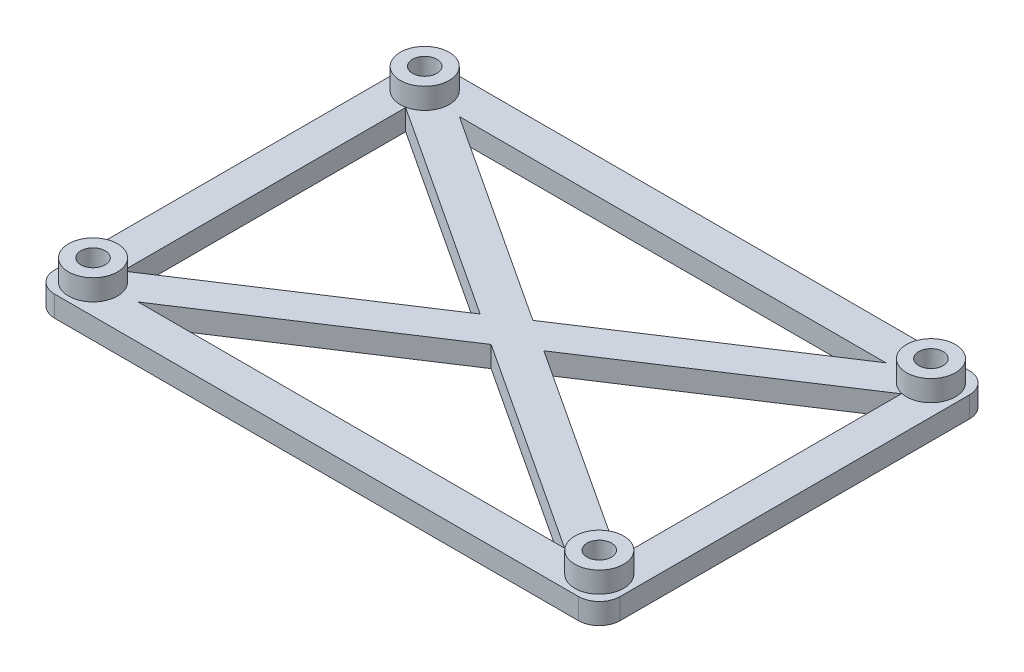
ISO-10303-21;
HEADER;
FILE_DESCRIPTION(('STEP AP214'),'2;1');
FILE_NAME('part.step','',(''),(''),'','','');
FILE_SCHEMA(('AUTOMOTIVE_DESIGN { 1 0 10303 214 1 1 1 1 }'));
ENDSEC;
DATA;
#1=APPLICATION_CONTEXT('core data for automotive mechanical design processes');
#2=APPLICATION_PROTOCOL_DEFINITION('international standard','automotive_design',2000,#1);
#3=PRODUCT_CONTEXT('',#1,'mechanical');
#4=PRODUCT('Part','Part','',(#3));
#5=PRODUCT_RELATED_PRODUCT_CATEGORY('part','',(#4));
#6=PRODUCT_DEFINITION_FORMATION('','',#4);
#7=PRODUCT_DEFINITION_CONTEXT('part definition',#1,'design');
#8=PRODUCT_DEFINITION('design','',#6,#7);
#9=PRODUCT_DEFINITION_SHAPE('','',#8);
#10=(LENGTH_UNIT() NAMED_UNIT(*) SI_UNIT(.MILLI.,.METRE.));
#11=(NAMED_UNIT(*) PLANE_ANGLE_UNIT() SI_UNIT($,.RADIAN.));
#12=(NAMED_UNIT(*) SI_UNIT($,.STERADIAN.) SOLID_ANGLE_UNIT());
#13=UNCERTAINTY_MEASURE_WITH_UNIT(LENGTH_MEASURE(1.E-05),#10,'distance_accuracy_value','');
#14=(GEOMETRIC_REPRESENTATION_CONTEXT(3) GLOBAL_UNCERTAINTY_ASSIGNED_CONTEXT((#13)) GLOBAL_UNIT_ASSIGNED_CONTEXT((#10,
#11,#12)) REPRESENTATION_CONTEXT('',''));
#15=CARTESIAN_POINT('',(0.,0.,0.));
#16=DIRECTION('',(0.,0.,1.));
#17=DIRECTION('',(1.,0.,0.));
#18=AXIS2_PLACEMENT_3D('',#15,#16,#17);
#19=CARTESIAN_POINT('',(0.,3.,0.));
#20=DIRECTION('',(0.,1.,0.));
#21=DIRECTION('',(0.,0.,1.));
#22=AXIS2_PLACEMENT_3D('',#19,#20,#21);
#23=PLANE('',#22);
#24=DIRECTION('',(0.,0.,-1.));
#25=VECTOR('',#24,1.);
#26=CARTESIAN_POINT('',(35.5,3.,0.));
#27=LINE('',#26,#25);
#28=CARTESIAN_POINT('',(35.5,3.,20.2698386511448));
#29=VERTEX_POINT('',#28);
#30=CARTESIAN_POINT('',(35.5,3.,-20.2698386511449));
#31=VERTEX_POINT('',#30);
#32=EDGE_CURVE('E307',#29,#31,#27,.T.);
#33=ORIENTED_EDGE('',*,*,#32,.F.);
#34=DIRECTION('',(0.836461129579753,0.,0.548026257310873));
#35=VECTOR('',#34,1.);
#36=CARTESIAN_POINT('',(1.37006564327722,3.,-2.09115282394944));
#37=LINE('',#36,#35);
#38=CARTESIAN_POINT('',(4.56182521667361,3.,0.));
#39=VERTEX_POINT('',#38);
#40=EDGE_CURVE('E302',#39,#29,#37,.T.);
#41=ORIENTED_EDGE('',*,*,#40,.F.);
#42=DIRECTION('',(-0.836461129579753,0.,0.548026257310873));
#43=VECTOR('',#42,1.);
#44=CARTESIAN_POINT('',(1.37006564327715,3.,2.09115282394934));
#45=LINE('',#44,#43);
#46=EDGE_CURVE('E301',#31,#39,#45,.T.);
#47=ORIENTED_EDGE('',*,*,#46,.F.);
#48=EDGE_LOOP('',(#33,#41,#47));
#49=FACE_BOUND('',#48,.T.);
#50=DIRECTION('',(-0.836461129579754,0.,-0.548026257310873));
#51=VECTOR('',#50,1.);
#52=CARTESIAN_POINT('',(-1.37006564327714,3.,2.09115282394933));
#53=LINE('',#52,#51);
#54=CARTESIAN_POINT('',(-4.5618252166736,3.,0.));
#55=VERTEX_POINT('',#54);
#56=CARTESIAN_POINT('',(-35.5,3.,-20.2698386511449));
#57=VERTEX_POINT('',#56);
#58=EDGE_CURVE('E299',#55,#57,#53,.T.);
#59=ORIENTED_EDGE('',*,*,#58,.F.);
#60=DIRECTION('',(0.836461129579753,0.,-0.548026257310873));
#61=VECTOR('',#60,1.);
#62=CARTESIAN_POINT('',(-1.37006564327721,3.,-2.09115282394943));
#63=LINE('',#62,#61);
#64=CARTESIAN_POINT('',(-35.5,3.,20.2698386511448));
#65=VERTEX_POINT('',#64);
#66=EDGE_CURVE('E295',#65,#55,#63,.T.);
#67=ORIENTED_EDGE('',*,*,#66,.F.);
#68=DIRECTION('',(0.,0.,1.));
#69=VECTOR('',#68,1.);
#70=CARTESIAN_POINT('',(-35.5,3.,0.));
#71=LINE('',#70,#69);
#72=EDGE_CURVE('E293',#57,#65,#71,.T.);
#73=ORIENTED_EDGE('',*,*,#72,.F.);
#74=EDGE_LOOP('',(#59,#67,#73));
#75=FACE_BOUND('',#74,.T.);
#76=DIRECTION('',(0.836461129579753,0.,0.548026257310873));
#77=VECTOR('',#76,1.);
#78=CARTESIAN_POINT('',(1.37006564327721,3.,-2.09115282394943));
#79=LINE('',#78,#77);
#80=CARTESIAN_POINT('',(-30.543437941221,3.,-23.));
#81=VERTEX_POINT('',#80);
#82=CARTESIAN_POINT('',(0.,3.,-2.98878203851036));
#83=VERTEX_POINT('',#82);
#84=EDGE_CURVE('E192',#81,#83,#79,.T.);
#85=ORIENTED_EDGE('',*,*,#84,.F.);
#86=DIRECTION('',(-1.,0.,0.));
#87=VECTOR('',#86,1.);
#88=CARTESIAN_POINT('',(0.,3.,-23.));
#89=LINE('',#88,#87);
#90=CARTESIAN_POINT('',(30.543437941221,3.,-23.));
#91=VERTEX_POINT('',#90);
#92=EDGE_CURVE('E283',#91,#81,#89,.T.);
#93=ORIENTED_EDGE('',*,*,#92,.F.);
#94=DIRECTION('',(0.836461129579753,0.,-0.548026257310873));
#95=VECTOR('',#94,1.);
#96=CARTESIAN_POINT('',(-1.37006564327722,3.,-2.09115282394944));
#97=LINE('',#96,#95);
#98=EDGE_CURVE('E290',#83,#91,#97,.T.);
#99=ORIENTED_EDGE('',*,*,#98,.F.);
#100=EDGE_LOOP('',(#85,#93,#99));
#101=FACE_BOUND('',#100,.T.);
#102=DIRECTION('',(1.,0.,0.));
#103=VECTOR('',#102,1.);
#104=CARTESIAN_POINT('',(0.,3.,23.));
#105=LINE('',#104,#103);
#106=CARTESIAN_POINT('',(-30.5434379412212,3.,23.));
#107=VERTEX_POINT('',#106);
#108=CARTESIAN_POINT('',(30.5434379412212,3.,23.));
#109=VERTEX_POINT('',#108);
#110=EDGE_CURVE('E281',#107,#109,#105,.T.);
#111=ORIENTED_EDGE('',*,*,#110,.F.);
#112=DIRECTION('',(-0.836461129579753,0.,0.548026257310873));
#113=VECTOR('',#112,1.);
#114=CARTESIAN_POINT('',(1.37006564327716,3.,2.09115282394936));
#115=LINE('',#114,#113);
#116=CARTESIAN_POINT('',(0.,3.,2.98878203851025));
#117=VERTEX_POINT('',#116);
#118=EDGE_CURVE('E268',#117,#107,#115,.T.);
#119=ORIENTED_EDGE('',*,*,#118,.F.);
#120=DIRECTION('',(-0.836461129579753,0.,-0.548026257310873));
#121=VECTOR('',#120,1.);
#122=CARTESIAN_POINT('',(-1.37006564327715,3.,2.09115282394934));
#123=LINE('',#122,#121);
#124=EDGE_CURVE('E280',#109,#117,#123,.T.);
#125=ORIENTED_EDGE('',*,*,#124,.F.);
#126=EDGE_LOOP('',(#111,#119,#125));
#127=FACE_BOUND('',#126,.T.);
#128=CARTESIAN_POINT('',(36.25,3.,-23.75));
#129=DIRECTION('',(0.,1.,0.));
#130=DIRECTION('',(0.,0.,1.));
#131=AXIS2_PLACEMENT_3D('',#128,#129,#130);
#132=CIRCLE('',#131,3.5);
#133=CARTESIAN_POINT('',(36.25,3.,-20.25));
#134=VERTEX_POINT('',#133);
#135=EDGE_CURVE('E405',#134,#134,#132,.T.);
#136=ORIENTED_EDGE('',*,*,#135,.F.);
#137=EDGE_LOOP('',(#136));
#138=FACE_BOUND('',#137,.T.);
#139=DIRECTION('',(0.,0.,-1.));
#140=VECTOR('',#139,1.);
#141=CARTESIAN_POINT('',(40.5,3.,28.));
#142=LINE('',#141,#140);
#143=CARTESIAN_POINT('',(40.5,3.,25.));
#144=VERTEX_POINT('',#143);
#145=CARTESIAN_POINT('',(40.5,3.,-25.));
#146=VERTEX_POINT('',#145);
#147=EDGE_CURVE('E378',#144,#146,#142,.T.);
#148=ORIENTED_EDGE('',*,*,#147,.T.);
#149=CARTESIAN_POINT('',(37.5,3.,-25.));
#150=DIRECTION('',(0.,1.,0.));
#151=DIRECTION('',(0.,0.,1.));
#152=AXIS2_PLACEMENT_3D('',#149,#150,#151);
#153=CIRCLE('',#152,3.);
#154=CARTESIAN_POINT('',(37.5,3.,-28.));
#155=VERTEX_POINT('',#154);
#156=EDGE_CURVE('E442',#146,#155,#153,.T.);
#157=ORIENTED_EDGE('',*,*,#156,.T.);
#158=DIRECTION('',(-1.,0.,0.));
#159=VECTOR('',#158,1.);
#160=CARTESIAN_POINT('',(40.5,3.,-28.));
#161=LINE('',#160,#159);
#162=CARTESIAN_POINT('',(-37.5,3.,-28.));
#163=VERTEX_POINT('',#162);
#164=EDGE_CURVE('E352',#155,#163,#161,.T.);
#165=ORIENTED_EDGE('',*,*,#164,.T.);
#166=CARTESIAN_POINT('',(-37.5,3.,-25.));
#167=DIRECTION('',(0.,1.,0.));
#168=DIRECTION('',(0.,0.,1.));
#169=AXIS2_PLACEMENT_3D('',#166,#167,#168);
#170=CIRCLE('',#169,3.);
#171=CARTESIAN_POINT('',(-40.5,3.,-25.));
#172=VERTEX_POINT('',#171);
#173=EDGE_CURVE('E435',#163,#172,#170,.T.);
#174=ORIENTED_EDGE('',*,*,#173,.T.);
#175=DIRECTION('',(0.,0.,1.));
#176=VECTOR('',#175,1.);
#177=CARTESIAN_POINT('',(-40.5,3.,28.));
#178=LINE('',#177,#176);
#179=CARTESIAN_POINT('',(-40.5,3.,25.));
#180=VERTEX_POINT('',#179);
#181=EDGE_CURVE('E369',#172,#180,#178,.T.);
#182=ORIENTED_EDGE('',*,*,#181,.T.);
#183=CARTESIAN_POINT('',(-37.5,3.,25.));
#184=DIRECTION('',(0.,1.,0.));
#185=DIRECTION('',(0.,0.,1.));
#186=AXIS2_PLACEMENT_3D('',#183,#184,#185);
#187=CIRCLE('',#186,3.);
#188=CARTESIAN_POINT('',(-37.5,3.,28.));
#189=VERTEX_POINT('',#188);
#190=EDGE_CURVE('E434',#180,#189,#187,.T.);
#191=ORIENTED_EDGE('',*,*,#190,.T.);
#192=DIRECTION('',(1.,0.,0.));
#193=VECTOR('',#192,1.);
#194=CARTESIAN_POINT('',(40.5,3.,28.));
#195=LINE('',#194,#193);
#196=CARTESIAN_POINT('',(37.5,3.,28.));
#197=VERTEX_POINT('',#196);
#198=EDGE_CURVE('E373',#189,#197,#195,.T.);
#199=ORIENTED_EDGE('',*,*,#198,.T.);
#200=CARTESIAN_POINT('',(37.5,3.,25.));
#201=DIRECTION('',(0.,1.,0.));
#202=DIRECTION('',(0.,0.,1.));
#203=AXIS2_PLACEMENT_3D('',#200,#201,#202);
#204=CIRCLE('',#203,3.);
#205=EDGE_CURVE('E437',#197,#144,#204,.T.);
#206=ORIENTED_EDGE('',*,*,#205,.T.);
#207=EDGE_LOOP('',(#148,#157,#165,#174,#182,#191,#199,#206));
#208=FACE_BOUND('',#207,.T.);
#209=CARTESIAN_POINT('',(-36.25,3.,-23.75));
#210=DIRECTION('',(0.,1.,0.));
#211=DIRECTION('',(0.,0.,1.));
#212=AXIS2_PLACEMENT_3D('',#209,#210,#211);
#213=CIRCLE('',#212,3.5);
#214=CARTESIAN_POINT('',(-36.25,3.,-20.25));
#215=VERTEX_POINT('',#214);
#216=EDGE_CURVE('E350',#215,#215,#213,.T.);
#217=ORIENTED_EDGE('',*,*,#216,.F.);
#218=EDGE_LOOP('',(#217));
#219=FACE_BOUND('',#218,.T.);
#220=CARTESIAN_POINT('',(-36.25,3.,23.75));
#221=DIRECTION('',(0.,1.,0.));
#222=DIRECTION('',(0.,0.,1.));
#223=AXIS2_PLACEMENT_3D('',#220,#221,#222);
#224=CIRCLE('',#223,3.5);
#225=CARTESIAN_POINT('',(-36.25,3.,27.25));
#226=VERTEX_POINT('',#225);
#227=EDGE_CURVE('E351',#226,#226,#224,.T.);
#228=ORIENTED_EDGE('',*,*,#227,.F.);
#229=EDGE_LOOP('',(#228));
#230=FACE_BOUND('',#229,.T.);
#231=CARTESIAN_POINT('',(36.25,3.,23.75));
#232=DIRECTION('',(0.,1.,0.));
#233=DIRECTION('',(0.,0.,-1.));
#234=AXIS2_PLACEMENT_3D('',#231,#232,#233);
#235=CIRCLE('',#234,3.5);
#236=CARTESIAN_POINT('',(36.25,3.,20.25));
#237=VERTEX_POINT('',#236);
#238=EDGE_CURVE('E325',#237,#237,#235,.T.);
#239=ORIENTED_EDGE('',*,*,#238,.F.);
#240=EDGE_LOOP('',(#239));
#241=FACE_BOUND('',#240,.T.);
#242=ADVANCED_FACE('F50',(#49,#75,#101,#127,#138,#208,#219,#230,#241),#23,.T.);
#243=CARTESIAN_POINT('',(-40.5,3.,28.));
#244=DIRECTION('',(1.,0.,0.));
#245=DIRECTION('',(0.,0.,-1.));
#246=AXIS2_PLACEMENT_3D('',#243,#244,#245);
#247=PLANE('',#246);
#248=DIRECTION('',(0.,0.,1.));
#249=VECTOR('',#248,1.);
#250=CARTESIAN_POINT('',(-40.5,0.,28.));
#251=LINE('',#250,#249);
#252=CARTESIAN_POINT('',(-40.5,0.,-25.));
#253=VERTEX_POINT('',#252);
#254=CARTESIAN_POINT('',(-40.5,0.,25.));
#255=VERTEX_POINT('',#254);
#256=EDGE_CURVE('E366',#253,#255,#251,.T.);
#257=ORIENTED_EDGE('',*,*,#256,.T.);
#258=DIRECTION('',(0.,-1.,0.));
#259=VECTOR('',#258,1.);
#260=CARTESIAN_POINT('',(-40.5,3.,25.));
#261=LINE('',#260,#259);
#262=EDGE_CURVE('E11',#255,#180,#261,.F.);
#263=ORIENTED_EDGE('',*,*,#262,.T.);
#264=ORIENTED_EDGE('',*,*,#181,.F.);
#265=DIRECTION('',(0.,-1.,0.));
#266=VECTOR('',#265,1.);
#267=CARTESIAN_POINT('',(-40.5,3.,-25.));
#268=LINE('',#267,#266);
#269=EDGE_CURVE('E57',#172,#253,#268,.T.);
#270=ORIENTED_EDGE('',*,*,#269,.T.);
#271=EDGE_LOOP('',(#257,#263,#264,#270));
#272=FACE_BOUND('',#271,.T.);
#273=ADVANCED_FACE('F457',(#272),#247,.F.);
#274=CARTESIAN_POINT('',(40.5,3.,28.));
#275=DIRECTION('',(0.,0.,-1.));
#276=DIRECTION('',(-1.,0.,0.));
#277=AXIS2_PLACEMENT_3D('',#274,#275,#276);
#278=PLANE('',#277);
#279=DIRECTION('',(1.,0.,0.));
#280=VECTOR('',#279,1.);
#281=CARTESIAN_POINT('',(40.5,0.,28.));
#282=LINE('',#281,#280);
#283=CARTESIAN_POINT('',(-37.5,0.,28.));
#284=VERTEX_POINT('',#283);
#285=CARTESIAN_POINT('',(37.5,0.,28.));
#286=VERTEX_POINT('',#285);
#287=EDGE_CURVE('E389',#284,#286,#282,.T.);
#288=ORIENTED_EDGE('',*,*,#287,.T.);
#289=DIRECTION('',(0.,-1.,0.));
#290=VECTOR('',#289,1.);
#291=CARTESIAN_POINT('',(37.5,3.,28.));
#292=LINE('',#291,#290);
#293=EDGE_CURVE('E449',#286,#197,#292,.F.);
#294=ORIENTED_EDGE('',*,*,#293,.T.);
#295=ORIENTED_EDGE('',*,*,#198,.F.);
#296=DIRECTION('',(0.,-1.,0.));
#297=VECTOR('',#296,1.);
#298=CARTESIAN_POINT('',(-37.5,3.,28.));
#299=LINE('',#298,#297);
#300=EDGE_CURVE('E441',#189,#284,#299,.T.);
#301=ORIENTED_EDGE('',*,*,#300,.T.);
#302=EDGE_LOOP('',(#288,#294,#295,#301));
#303=FACE_BOUND('',#302,.T.);
#304=ADVANCED_FACE('F466',(#303),#278,.F.);
#305=CARTESIAN_POINT('',(40.5,3.,28.));
#306=DIRECTION('',(-1.,0.,0.));
#307=DIRECTION('',(0.,0.,1.));
#308=AXIS2_PLACEMENT_3D('',#305,#306,#307);
#309=PLANE('',#308);
#310=DIRECTION('',(0.,0.,-1.));
#311=VECTOR('',#310,1.);
#312=CARTESIAN_POINT('',(40.5,0.,28.));
#313=LINE('',#312,#311);
#314=CARTESIAN_POINT('',(40.5,0.,25.));
#315=VERTEX_POINT('',#314);
#316=CARTESIAN_POINT('',(40.5,0.,-25.));
#317=VERTEX_POINT('',#316);
#318=EDGE_CURVE('E392',#315,#317,#313,.T.);
#319=ORIENTED_EDGE('',*,*,#318,.T.);
#320=DIRECTION('',(0.,-1.,0.));
#321=VECTOR('',#320,1.);
#322=CARTESIAN_POINT('',(40.5,3.,-25.));
#323=LINE('',#322,#321);
#324=EDGE_CURVE('E427',#317,#146,#323,.F.);
#325=ORIENTED_EDGE('',*,*,#324,.T.);
#326=ORIENTED_EDGE('',*,*,#147,.F.);
#327=DIRECTION('',(0.,-1.,0.));
#328=VECTOR('',#327,1.);
#329=CARTESIAN_POINT('',(40.5,3.,25.));
#330=LINE('',#329,#328);
#331=EDGE_CURVE('E422',#144,#315,#330,.T.);
#332=ORIENTED_EDGE('',*,*,#331,.T.);
#333=EDGE_LOOP('',(#319,#325,#326,#332));
#334=FACE_BOUND('',#333,.T.);
#335=ADVANCED_FACE('F477',(#334),#309,.F.);
#336=CARTESIAN_POINT('',(40.5,3.,-28.));
#337=DIRECTION('',(0.,0.,1.));
#338=DIRECTION('',(1.,0.,0.));
#339=AXIS2_PLACEMENT_3D('',#336,#337,#338);
#340=PLANE('',#339);
#341=ORIENTED_EDGE('',*,*,#164,.F.);
#342=DIRECTION('',(0.,-1.,0.));
#343=VECTOR('',#342,1.);
#344=CARTESIAN_POINT('',(37.5,3.,-28.));
#345=LINE('',#344,#343);
#346=CARTESIAN_POINT('',(37.5,0.,-28.));
#347=VERTEX_POINT('',#346);
#348=EDGE_CURVE('E408',#155,#347,#345,.T.);
#349=ORIENTED_EDGE('',*,*,#348,.T.);
#350=DIRECTION('',(-1.,0.,0.));
#351=VECTOR('',#350,1.);
#352=CARTESIAN_POINT('',(40.5,0.,-28.));
#353=LINE('',#352,#351);
#354=CARTESIAN_POINT('',(-37.5,0.,-28.));
#355=VERTEX_POINT('',#354);
#356=EDGE_CURVE('E372',#347,#355,#353,.T.);
#357=ORIENTED_EDGE('',*,*,#356,.T.);
#358=DIRECTION('',(0.,-1.,0.));
#359=VECTOR('',#358,1.);
#360=CARTESIAN_POINT('',(-37.5,3.,-28.));
#361=LINE('',#360,#359);
#362=EDGE_CURVE('E406',#355,#163,#361,.F.);
#363=ORIENTED_EDGE('',*,*,#362,.T.);
#364=EDGE_LOOP('',(#341,#349,#357,#363));
#365=FACE_BOUND('',#364,.T.);
#366=ADVANCED_FACE('F488',(#365),#340,.F.);
#367=CARTESIAN_POINT('',(0.,0.,0.));
#368=DIRECTION('',(0.,1.,0.));
#369=DIRECTION('',(0.,0.,1.));
#370=AXIS2_PLACEMENT_3D('',#367,#368,#369);
#371=PLANE('',#370);
#372=DIRECTION('',(-0.836461129579753,0.,-0.548026257310873));
#373=VECTOR('',#372,1.);
#374=CARTESIAN_POINT('',(35.5,0.,20.2698386511448));
#375=LINE('',#374,#373);
#376=CARTESIAN_POINT('',(35.5,0.,20.2698386511448));
#377=VERTEX_POINT('',#376);
#378=CARTESIAN_POINT('',(4.56182521667361,0.,0.));
#379=VERTEX_POINT('',#378);
#380=EDGE_CURVE('E235',#377,#379,#375,.T.);
#381=ORIENTED_EDGE('',*,*,#380,.F.);
#382=DIRECTION('',(0.,0.,1.));
#383=VECTOR('',#382,1.);
#384=CARTESIAN_POINT('',(35.5,0.,20.2698386511448));
#385=LINE('',#384,#383);
#386=CARTESIAN_POINT('',(35.5,0.,-20.2698386511449));
#387=VERTEX_POINT('',#386);
#388=EDGE_CURVE('E233',#387,#377,#385,.T.);
#389=ORIENTED_EDGE('',*,*,#388,.F.);
#390=DIRECTION('',(0.836461129579753,0.,-0.548026257310873));
#391=VECTOR('',#390,1.);
#392=CARTESIAN_POINT('',(4.56182521667361,0.,0.));
#393=LINE('',#392,#391);
#394=EDGE_CURVE('E225',#379,#387,#393,.T.);
#395=ORIENTED_EDGE('',*,*,#394,.F.);
#396=EDGE_LOOP('',(#381,#389,#395));
#397=FACE_BOUND('',#396,.T.);
#398=DIRECTION('',(-0.836461129579753,0.,0.548026257310873));
#399=VECTOR('',#398,1.);
#400=CARTESIAN_POINT('',(-35.5,0.,20.2698386511448));
#401=LINE('',#400,#399);
#402=CARTESIAN_POINT('',(-4.5618252166736,0.,0.));
#403=VERTEX_POINT('',#402);
#404=CARTESIAN_POINT('',(-35.5,0.,20.2698386511448));
#405=VERTEX_POINT('',#404);
#406=EDGE_CURVE('E246',#403,#405,#401,.T.);
#407=ORIENTED_EDGE('',*,*,#406,.F.);
#408=DIRECTION('',(0.836461129579754,0.,0.548026257310873));
#409=VECTOR('',#408,1.);
#410=CARTESIAN_POINT('',(-4.5618252166736,0.,0.));
#411=LINE('',#410,#409);
#412=CARTESIAN_POINT('',(-35.5,0.,-20.2698386511449));
#413=VERTEX_POINT('',#412);
#414=EDGE_CURVE('E229',#413,#403,#411,.T.);
#415=ORIENTED_EDGE('',*,*,#414,.F.);
#416=DIRECTION('',(0.,0.,-1.));
#417=VECTOR('',#416,1.);
#418=CARTESIAN_POINT('',(-35.5,0.,-20.2698386511449));
#419=LINE('',#418,#417);
#420=EDGE_CURVE('E244',#405,#413,#419,.T.);
#421=ORIENTED_EDGE('',*,*,#420,.F.);
#422=EDGE_LOOP('',(#407,#415,#421));
#423=FACE_BOUND('',#422,.T.);
#424=DIRECTION('',(1.,0.,0.));
#425=VECTOR('',#424,1.);
#426=CARTESIAN_POINT('',(30.543437941221,0.,-23.));
#427=LINE('',#426,#425);
#428=CARTESIAN_POINT('',(-30.543437941221,0.,-23.));
#429=VERTEX_POINT('',#428);
#430=CARTESIAN_POINT('',(30.543437941221,0.,-23.));
#431=VERTEX_POINT('',#430);
#432=EDGE_CURVE('E202',#429,#431,#427,.T.);
#433=ORIENTED_EDGE('',*,*,#432,.F.);
#434=DIRECTION('',(-0.836461129579753,0.,-0.548026257310873));
#435=VECTOR('',#434,1.);
#436=CARTESIAN_POINT('',(0.,0.,-2.98878203851036));
#437=LINE('',#436,#435);
#438=CARTESIAN_POINT('',(0.,0.,-2.98878203851036));
#439=VERTEX_POINT('',#438);
#440=EDGE_CURVE('E189',#439,#429,#437,.T.);
#441=ORIENTED_EDGE('',*,*,#440,.F.);
#442=DIRECTION('',(-0.836461129579753,0.,0.548026257310873));
#443=VECTOR('',#442,1.);
#444=CARTESIAN_POINT('',(0.,0.,-2.98878203851036));
#445=LINE('',#444,#443);
#446=EDGE_CURVE('E200',#431,#439,#445,.T.);
#447=ORIENTED_EDGE('',*,*,#446,.F.);
#448=EDGE_LOOP('',(#433,#441,#447));
#449=FACE_BOUND('',#448,.T.);
#450=DIRECTION('',(0.836461129579753,0.,-0.548026257310873));
#451=VECTOR('',#450,1.);
#452=CARTESIAN_POINT('',(-30.5434379412212,0.,23.));
#453=LINE('',#452,#451);
#454=CARTESIAN_POINT('',(-30.5434379412212,0.,23.));
#455=VERTEX_POINT('',#454);
#456=CARTESIAN_POINT('',(0.,0.,2.98878203851024));
#457=VERTEX_POINT('',#456);
#458=EDGE_CURVE('E258',#455,#457,#453,.T.);
#459=ORIENTED_EDGE('',*,*,#458,.F.);
#460=DIRECTION('',(-1.,0.,0.));
#461=VECTOR('',#460,1.);
#462=CARTESIAN_POINT('',(-30.5434379412212,0.,23.));
#463=LINE('',#462,#461);
#464=CARTESIAN_POINT('',(30.5434379412212,0.,23.));
#465=VERTEX_POINT('',#464);
#466=EDGE_CURVE('E236',#465,#455,#463,.T.);
#467=ORIENTED_EDGE('',*,*,#466,.F.);
#468=DIRECTION('',(0.836461129579753,0.,0.548026257310873));
#469=VECTOR('',#468,1.);
#470=CARTESIAN_POINT('',(30.5434379412212,0.,23.));
#471=LINE('',#470,#469);
#472=EDGE_CURVE('E257',#457,#465,#471,.T.);
#473=ORIENTED_EDGE('',*,*,#472,.F.);
#474=EDGE_LOOP('',(#459,#467,#473));
#475=FACE_BOUND('',#474,.T.);
#476=CARTESIAN_POINT('',(36.25,0.,23.7499999999999));
#477=DIRECTION('',(0.,-1.,0.));
#478=DIRECTION('',(0.,0.,-1.));
#479=AXIS2_PLACEMENT_3D('',#476,#477,#478);
#480=CIRCLE('',#479,1.75);
#481=CARTESIAN_POINT('',(36.25,0.,21.9999999999999));
#482=VERTEX_POINT('',#481);
#483=EDGE_CURVE('E347',#482,#482,#480,.T.);
#484=ORIENTED_EDGE('',*,*,#483,.F.);
#485=EDGE_LOOP('',(#484));
#486=FACE_BOUND('',#485,.T.);
#487=CARTESIAN_POINT('',(36.25,0.,-23.7500000000001));
#488=DIRECTION('',(0.,-1.,0.));
#489=DIRECTION('',(0.,0.,-1.));
#490=AXIS2_PLACEMENT_3D('',#487,#488,#489);
#491=CIRCLE('',#490,1.75);
#492=CARTESIAN_POINT('',(36.25,0.,-25.5000000000001));
#493=VERTEX_POINT('',#492);
#494=EDGE_CURVE('E359',#493,#493,#491,.T.);
#495=ORIENTED_EDGE('',*,*,#494,.F.);
#496=EDGE_LOOP('',(#495));
#497=FACE_BOUND('',#496,.T.);
#498=CARTESIAN_POINT('',(-36.25,0.,-23.75));
#499=DIRECTION('',(0.,-1.,0.));
#500=DIRECTION('',(0.,0.,-1.));
#501=AXIS2_PLACEMENT_3D('',#498,#499,#500);
#502=CIRCLE('',#501,1.75);
#503=CARTESIAN_POINT('',(-36.25,0.,-25.5));
#504=VERTEX_POINT('',#503);
#505=EDGE_CURVE('E354',#504,#504,#502,.T.);
#506=ORIENTED_EDGE('',*,*,#505,.F.);
#507=EDGE_LOOP('',(#506));
#508=FACE_BOUND('',#507,.T.);
#509=CARTESIAN_POINT('',(-36.25,0.,23.75));
#510=DIRECTION('',(0.,-1.,0.));
#511=DIRECTION('',(0.,0.,-1.));
#512=AXIS2_PLACEMENT_3D('',#509,#510,#511);
#513=CIRCLE('',#512,1.75);
#514=CARTESIAN_POINT('',(-36.25,0.,21.9999999999999));
#515=VERTEX_POINT('',#514);
#516=EDGE_CURVE('E360',#515,#515,#513,.T.);
#517=ORIENTED_EDGE('',*,*,#516,.F.);
#518=EDGE_LOOP('',(#517));
#519=FACE_BOUND('',#518,.T.);
#520=ORIENTED_EDGE('',*,*,#356,.F.);
#521=CARTESIAN_POINT('',(37.5,0.,-25.));
#522=DIRECTION('',(0.,1.,0.));
#523=DIRECTION('',(0.,0.,1.));
#524=AXIS2_PLACEMENT_3D('',#521,#522,#523);
#525=CIRCLE('',#524,3.);
#526=EDGE_CURVE('E425',#347,#317,#525,.F.);
#527=ORIENTED_EDGE('',*,*,#526,.T.);
#528=ORIENTED_EDGE('',*,*,#318,.F.);
#529=CARTESIAN_POINT('',(37.5,0.,25.));
#530=DIRECTION('',(0.,1.,0.));
#531=DIRECTION('',(0.,0.,1.));
#532=AXIS2_PLACEMENT_3D('',#529,#530,#531);
#533=CIRCLE('',#532,3.);
#534=EDGE_CURVE('E420',#315,#286,#533,.F.);
#535=ORIENTED_EDGE('',*,*,#534,.T.);
#536=ORIENTED_EDGE('',*,*,#287,.F.);
#537=CARTESIAN_POINT('',(-37.5,0.,25.));
#538=DIRECTION('',(0.,1.,0.));
#539=DIRECTION('',(0.,0.,1.));
#540=AXIS2_PLACEMENT_3D('',#537,#538,#539);
#541=CIRCLE('',#540,3.);
#542=EDGE_CURVE('E418',#284,#255,#541,.F.);
#543=ORIENTED_EDGE('',*,*,#542,.T.);
#544=ORIENTED_EDGE('',*,*,#256,.F.);
#545=CARTESIAN_POINT('',(-37.5,0.,-25.));
#546=DIRECTION('',(0.,1.,0.));
#547=DIRECTION('',(0.,0.,1.));
#548=AXIS2_PLACEMENT_3D('',#545,#546,#547);
#549=CIRCLE('',#548,3.);
#550=EDGE_CURVE('E414',#253,#355,#549,.F.);
#551=ORIENTED_EDGE('',*,*,#550,.T.);
#552=EDGE_LOOP('',(#520,#527,#528,#535,#536,#543,#544,#551));
#553=FACE_BOUND('',#552,.T.);
#554=ADVANCED_FACE('F208',(#397,#423,#449,#475,#486,#497,#508,#519,#553),#371,.F.);
#555=CARTESIAN_POINT('',(-36.25,3.,23.75));
#556=DIRECTION('',(0.,-1.,0.));
#557=DIRECTION('',(0.,0.,-1.));
#558=AXIS2_PLACEMENT_3D('',#555,#556,#557);
#559=CYLINDRICAL_SURFACE('',#558,1.75);
#560=ORIENTED_EDGE('',*,*,#516,.T.);
#561=EDGE_LOOP('',(#560));
#562=FACE_BOUND('',#561,.T.);
#563=CARTESIAN_POINT('',(-36.25,6.,23.75));
#564=DIRECTION('',(0.,-1.,0.));
#565=DIRECTION('',(0.,0.,-1.));
#566=AXIS2_PLACEMENT_3D('',#563,#564,#565);
#567=CIRCLE('',#566,1.75);
#568=CARTESIAN_POINT('',(-36.25,6.,22.));
#569=VERTEX_POINT('',#568);
#570=EDGE_CURVE('E330',#569,#569,#567,.T.);
#571=ORIENTED_EDGE('',*,*,#570,.F.);
#572=EDGE_LOOP('',(#571));
#573=FACE_BOUND('',#572,.T.);
#574=ADVANCED_FACE('F512',(#562,#573),#559,.F.);
#575=CARTESIAN_POINT('',(-36.25,3.,-23.75));
#576=DIRECTION('',(0.,-1.,0.));
#577=DIRECTION('',(0.,0.,-1.));
#578=AXIS2_PLACEMENT_3D('',#575,#576,#577);
#579=CYLINDRICAL_SURFACE('',#578,1.75);
#580=ORIENTED_EDGE('',*,*,#505,.T.);
#581=EDGE_LOOP('',(#580));
#582=FACE_BOUND('',#581,.T.);
#583=CARTESIAN_POINT('',(-36.25,6.,-23.75));
#584=DIRECTION('',(0.,1.,0.));
#585=DIRECTION('',(0.,0.,1.));
#586=AXIS2_PLACEMENT_3D('',#583,#584,#585);
#587=CIRCLE('',#586,1.75);
#588=CARTESIAN_POINT('',(-36.25,6.,-22.));
#589=VERTEX_POINT('',#588);
#590=EDGE_CURVE('E339',#589,#589,#587,.T.);
#591=ORIENTED_EDGE('',*,*,#590,.T.);
#592=EDGE_LOOP('',(#591));
#593=FACE_BOUND('',#592,.T.);
#594=ADVANCED_FACE('F683',(#582,#593),#579,.F.);
#595=CARTESIAN_POINT('',(36.25,3.,-23.7500000000001));
#596=DIRECTION('',(0.,-1.,0.));
#597=DIRECTION('',(0.,0.,-1.));
#598=AXIS2_PLACEMENT_3D('',#595,#596,#597);
#599=CYLINDRICAL_SURFACE('',#598,1.75);
#600=ORIENTED_EDGE('',*,*,#494,.T.);
#601=EDGE_LOOP('',(#600));
#602=FACE_BOUND('',#601,.T.);
#603=CARTESIAN_POINT('',(36.25,6.,-23.75));
#604=DIRECTION('',(0.,-1.,0.));
#605=DIRECTION('',(0.,0.,1.));
#606=AXIS2_PLACEMENT_3D('',#603,#604,#605);
#607=CIRCLE('',#606,1.75);
#608=CARTESIAN_POINT('',(36.25,6.,-22.));
#609=VERTEX_POINT('',#608);
#610=EDGE_CURVE('E309',#609,#609,#607,.T.);
#611=ORIENTED_EDGE('',*,*,#610,.F.);
#612=EDGE_LOOP('',(#611));
#613=FACE_BOUND('',#612,.T.);
#614=ADVANCED_FACE('F690',(#602,#613),#599,.F.);
#615=CARTESIAN_POINT('',(36.25,3.,23.7499999999999));
#616=DIRECTION('',(0.,-1.,0.));
#617=DIRECTION('',(0.,0.,-1.));
#618=AXIS2_PLACEMENT_3D('',#615,#616,#617);
#619=CYLINDRICAL_SURFACE('',#618,1.75);
#620=ORIENTED_EDGE('',*,*,#483,.T.);
#621=EDGE_LOOP('',(#620));
#622=FACE_BOUND('',#621,.T.);
#623=CARTESIAN_POINT('',(36.25,6.,23.75));
#624=DIRECTION('',(0.,1.,0.));
#625=DIRECTION('',(0.,0.,-1.));
#626=AXIS2_PLACEMENT_3D('',#623,#624,#625);
#627=CIRCLE('',#626,1.75);
#628=CARTESIAN_POINT('',(36.25,6.,22.));
#629=VERTEX_POINT('',#628);
#630=EDGE_CURVE('E318',#629,#629,#627,.T.);
#631=ORIENTED_EDGE('',*,*,#630,.T.);
#632=EDGE_LOOP('',(#631));
#633=FACE_BOUND('',#632,.T.);
#634=ADVANCED_FACE('F679',(#622,#633),#619,.F.);
#635=CARTESIAN_POINT('',(-36.25,6.,-23.75));
#636=DIRECTION('',(0.,1.,0.));
#637=DIRECTION('',(0.,0.,1.));
#638=AXIS2_PLACEMENT_3D('',#635,#636,#637);
#639=PLANE('',#638);
#640=CARTESIAN_POINT('',(-36.25,6.,-23.75));
#641=DIRECTION('',(0.,1.,0.));
#642=DIRECTION('',(0.,0.,1.));
#643=AXIS2_PLACEMENT_3D('',#640,#641,#642);
#644=CIRCLE('',#643,3.5);
#645=CARTESIAN_POINT('',(-36.25,6.,-20.25));
#646=VERTEX_POINT('',#645);
#647=EDGE_CURVE('E345',#646,#646,#644,.T.);
#648=ORIENTED_EDGE('',*,*,#647,.T.);
#649=EDGE_LOOP('',(#648));
#650=FACE_BOUND('',#649,.T.);
#651=ORIENTED_EDGE('',*,*,#590,.F.);
#652=EDGE_LOOP('',(#651));
#653=FACE_BOUND('',#652,.T.);
#654=ADVANCED_FACE('F677',(#650,#653),#639,.T.);
#655=CARTESIAN_POINT('',(-36.25,6.,-23.75));
#656=DIRECTION('',(0.,-1.,0.));
#657=DIRECTION('',(0.,0.,-1.));
#658=AXIS2_PLACEMENT_3D('',#655,#656,#657);
#659=CYLINDRICAL_SURFACE('',#658,3.5);
#660=ORIENTED_EDGE('',*,*,#647,.F.);
#661=EDGE_LOOP('',(#660));
#662=FACE_BOUND('',#661,.T.);
#663=ORIENTED_EDGE('',*,*,#216,.T.);
#664=EDGE_LOOP('',(#663));
#665=FACE_BOUND('',#664,.T.);
#666=ADVANCED_FACE('F671',(#662,#665),#659,.T.);
#667=CARTESIAN_POINT('',(-36.25,6.,23.75));
#668=DIRECTION('',(0.,-1.,0.));
#669=DIRECTION('',(0.,0.,-1.));
#670=AXIS2_PLACEMENT_3D('',#667,#668,#669);
#671=CYLINDRICAL_SURFACE('',#670,3.5);
#672=CARTESIAN_POINT('',(-36.25,6.,23.75));
#673=DIRECTION('',(0.,-1.,0.));
#674=DIRECTION('',(0.,0.,-1.));
#675=AXIS2_PLACEMENT_3D('',#672,#673,#674);
#676=CIRCLE('',#675,3.5);
#677=CARTESIAN_POINT('',(-36.25,6.,20.25));
#678=VERTEX_POINT('',#677);
#679=EDGE_CURVE('E331',#678,#678,#676,.T.);
#680=ORIENTED_EDGE('',*,*,#679,.T.);
#681=EDGE_LOOP('',(#680));
#682=FACE_BOUND('',#681,.T.);
#683=ORIENTED_EDGE('',*,*,#227,.T.);
#684=EDGE_LOOP('',(#683));
#685=FACE_BOUND('',#684,.T.);
#686=ADVANCED_FACE('F670',(#682,#685),#671,.T.);
#687=CARTESIAN_POINT('',(-36.25,6.,23.75));
#688=DIRECTION('',(0.,1.,0.));
#689=DIRECTION('',(0.,0.,-1.));
#690=AXIS2_PLACEMENT_3D('',#687,#688,#689);
#691=PLANE('',#690);
#692=ORIENTED_EDGE('',*,*,#570,.T.);
#693=EDGE_LOOP('',(#692));
#694=FACE_BOUND('',#693,.T.);
#695=ORIENTED_EDGE('',*,*,#679,.F.);
#696=EDGE_LOOP('',(#695));
#697=FACE_BOUND('',#696,.T.);
#698=ADVANCED_FACE('F664',(#694,#697),#691,.T.);
#699=CARTESIAN_POINT('',(36.25,6.,23.75));
#700=DIRECTION('',(0.,1.,0.));
#701=DIRECTION('',(0.,0.,-1.));
#702=AXIS2_PLACEMENT_3D('',#699,#700,#701);
#703=PLANE('',#702);
#704=CARTESIAN_POINT('',(36.25,6.,23.75));
#705=DIRECTION('',(0.,1.,0.));
#706=DIRECTION('',(0.,0.,-1.));
#707=AXIS2_PLACEMENT_3D('',#704,#705,#706);
#708=CIRCLE('',#707,3.5);
#709=CARTESIAN_POINT('',(36.25,6.,20.25));
#710=VERTEX_POINT('',#709);
#711=EDGE_CURVE('E323',#710,#710,#708,.T.);
#712=ORIENTED_EDGE('',*,*,#711,.T.);
#713=EDGE_LOOP('',(#712));
#714=FACE_BOUND('',#713,.T.);
#715=ORIENTED_EDGE('',*,*,#630,.F.);
#716=EDGE_LOOP('',(#715));
#717=FACE_BOUND('',#716,.T.);
#718=ADVANCED_FACE('F659',(#714,#717),#703,.T.);
#719=CARTESIAN_POINT('',(36.25,6.,23.75));
#720=DIRECTION('',(0.,-1.,0.));
#721=DIRECTION('',(0.,0.,-1.));
#722=AXIS2_PLACEMENT_3D('',#719,#720,#721);
#723=CYLINDRICAL_SURFACE('',#722,3.5);
#724=ORIENTED_EDGE('',*,*,#711,.F.);
#725=EDGE_LOOP('',(#724));
#726=FACE_BOUND('',#725,.T.);
#727=ORIENTED_EDGE('',*,*,#238,.T.);
#728=EDGE_LOOP('',(#727));
#729=FACE_BOUND('',#728,.T.);
#730=ADVANCED_FACE('F657',(#726,#729),#723,.T.);
#731=CARTESIAN_POINT('',(36.25,6.,-23.75));
#732=DIRECTION('',(0.,-1.,0.));
#733=DIRECTION('',(0.,0.,-1.));
#734=AXIS2_PLACEMENT_3D('',#731,#732,#733);
#735=CYLINDRICAL_SURFACE('',#734,3.5);
#736=CARTESIAN_POINT('',(36.25,6.,-23.75));
#737=DIRECTION('',(0.,-1.,0.));
#738=DIRECTION('',(0.,0.,1.));
#739=AXIS2_PLACEMENT_3D('',#736,#737,#738);
#740=CIRCLE('',#739,3.5);
#741=CARTESIAN_POINT('',(36.25,6.,-20.25));
#742=VERTEX_POINT('',#741);
#743=EDGE_CURVE('E314',#742,#742,#740,.T.);
#744=ORIENTED_EDGE('',*,*,#743,.T.);
#745=EDGE_LOOP('',(#744));
#746=FACE_BOUND('',#745,.T.);
#747=ORIENTED_EDGE('',*,*,#135,.T.);
#748=EDGE_LOOP('',(#747));
#749=FACE_BOUND('',#748,.T.);
#750=ADVANCED_FACE('F652',(#746,#749),#735,.T.);
#751=CARTESIAN_POINT('',(36.25,6.,-23.75));
#752=DIRECTION('',(0.,1.,0.));
#753=DIRECTION('',(0.,0.,1.));
#754=AXIS2_PLACEMENT_3D('',#751,#752,#753);
#755=PLANE('',#754);
#756=ORIENTED_EDGE('',*,*,#610,.T.);
#757=EDGE_LOOP('',(#756));
#758=FACE_BOUND('',#757,.T.);
#759=ORIENTED_EDGE('',*,*,#743,.F.);
#760=EDGE_LOOP('',(#759));
#761=FACE_BOUND('',#760,.T.);
#762=ADVANCED_FACE('F524',(#758,#761),#755,.T.);
#763=CARTESIAN_POINT('',(37.5,3.,-25.));
#764=DIRECTION('',(0.,-1.,0.));
#765=DIRECTION('',(0.,0.,-1.));
#766=AXIS2_PLACEMENT_3D('',#763,#764,#765);
#767=CYLINDRICAL_SURFACE('',#766,3.);
#768=ORIENTED_EDGE('',*,*,#156,.F.);
#769=ORIENTED_EDGE('',*,*,#324,.F.);
#770=ORIENTED_EDGE('',*,*,#526,.F.);
#771=ORIENTED_EDGE('',*,*,#348,.F.);
#772=EDGE_LOOP('',(#768,#769,#770,#771));
#773=FACE_BOUND('',#772,.T.);
#774=ADVANCED_FACE('F484',(#773),#767,.T.);
#775=CARTESIAN_POINT('',(37.5,3.,25.));
#776=DIRECTION('',(0.,-1.,0.));
#777=DIRECTION('',(0.,0.,-1.));
#778=AXIS2_PLACEMENT_3D('',#775,#776,#777);
#779=CYLINDRICAL_SURFACE('',#778,3.);
#780=ORIENTED_EDGE('',*,*,#205,.F.);
#781=ORIENTED_EDGE('',*,*,#293,.F.);
#782=ORIENTED_EDGE('',*,*,#534,.F.);
#783=ORIENTED_EDGE('',*,*,#331,.F.);
#784=EDGE_LOOP('',(#780,#781,#782,#783));
#785=FACE_BOUND('',#784,.T.);
#786=ADVANCED_FACE('F480',(#785),#779,.T.);
#787=CARTESIAN_POINT('',(-37.5,3.,25.));
#788=DIRECTION('',(0.,-1.,0.));
#789=DIRECTION('',(0.,0.,-1.));
#790=AXIS2_PLACEMENT_3D('',#787,#788,#789);
#791=CYLINDRICAL_SURFACE('',#790,3.);
#792=ORIENTED_EDGE('',*,*,#190,.F.);
#793=ORIENTED_EDGE('',*,*,#262,.F.);
#794=ORIENTED_EDGE('',*,*,#542,.F.);
#795=ORIENTED_EDGE('',*,*,#300,.F.);
#796=EDGE_LOOP('',(#792,#793,#794,#795));
#797=FACE_BOUND('',#796,.T.);
#798=ADVANCED_FACE('F467',(#797),#791,.T.);
#799=CARTESIAN_POINT('',(-37.5,3.,-25.));
#800=DIRECTION('',(0.,-1.,0.));
#801=DIRECTION('',(0.,0.,-1.));
#802=AXIS2_PLACEMENT_3D('',#799,#800,#801);
#803=CYLINDRICAL_SURFACE('',#802,3.);
#804=ORIENTED_EDGE('',*,*,#173,.F.);
#805=ORIENTED_EDGE('',*,*,#362,.F.);
#806=ORIENTED_EDGE('',*,*,#550,.F.);
#807=ORIENTED_EDGE('',*,*,#269,.F.);
#808=EDGE_LOOP('',(#804,#805,#806,#807));
#809=FACE_BOUND('',#808,.T.);
#810=ADVANCED_FACE('F47',(#809),#803,.T.);
#811=CARTESIAN_POINT('',(-30.5434379412212,6.,23.));
#812=DIRECTION('',(0.,0.,1.));
#813=DIRECTION('',(1.,0.,0.));
#814=AXIS2_PLACEMENT_3D('',#811,#812,#813);
#815=PLANE('',#814);
#816=ORIENTED_EDGE('',*,*,#110,.T.);
#817=DIRECTION('',(0.,-1.,0.));
#818=VECTOR('',#817,1.);
#819=CARTESIAN_POINT('',(30.5434379412212,6.,23.));
#820=LINE('',#819,#818);
#821=EDGE_CURVE('E264',#109,#465,#820,.T.);
#822=ORIENTED_EDGE('',*,*,#821,.T.);
#823=ORIENTED_EDGE('',*,*,#466,.T.);
#824=DIRECTION('',(0.,-1.,0.));
#825=VECTOR('',#824,1.);
#826=CARTESIAN_POINT('',(-30.5434379412212,6.,23.));
#827=LINE('',#826,#825);
#828=EDGE_CURVE('E262',#107,#455,#827,.T.);
#829=ORIENTED_EDGE('',*,*,#828,.F.);
#830=EDGE_LOOP('',(#816,#822,#823,#829));
#831=FACE_BOUND('',#830,.T.);
#832=ADVANCED_FACE('F491',(#831),#815,.F.);
#833=CARTESIAN_POINT('',(30.5434379412212,6.,23.));
#834=DIRECTION('',(0.548026257310873,0.,-0.836461129579753));
#835=DIRECTION('',(-0.836461129579753,0.,-0.548026257310873));
#836=AXIS2_PLACEMENT_3D('',#833,#834,#835);
#837=PLANE('',#836);
#838=ORIENTED_EDGE('',*,*,#124,.T.);
#839=DIRECTION('',(0.,-1.,0.));
#840=VECTOR('',#839,1.);
#841=CARTESIAN_POINT('',(0.,6.,2.98878203851024));
#842=LINE('',#841,#840);
#843=EDGE_CURVE('E267',#117,#457,#842,.T.);
#844=ORIENTED_EDGE('',*,*,#843,.T.);
#845=ORIENTED_EDGE('',*,*,#472,.T.);
#846=ORIENTED_EDGE('',*,*,#821,.F.);
#847=EDGE_LOOP('',(#838,#844,#845,#846));
#848=FACE_BOUND('',#847,.T.);
#849=ADVANCED_FACE('F500',(#848),#837,.F.);
#850=CARTESIAN_POINT('',(-30.5434379412212,6.,23.));
#851=DIRECTION('',(-0.548026257310873,0.,-0.836461129579753));
#852=DIRECTION('',(-0.836461129579753,0.,0.548026257310873));
#853=AXIS2_PLACEMENT_3D('',#850,#851,#852);
#854=PLANE('',#853);
#855=ORIENTED_EDGE('',*,*,#118,.T.);
#856=ORIENTED_EDGE('',*,*,#828,.T.);
#857=ORIENTED_EDGE('',*,*,#458,.T.);
#858=ORIENTED_EDGE('',*,*,#843,.F.);
#859=EDGE_LOOP('',(#855,#856,#857,#858));
#860=FACE_BOUND('',#859,.T.);
#861=ADVANCED_FACE('F551',(#860),#854,.F.);
#862=CARTESIAN_POINT('',(0.,6.,-2.98878203851036));
#863=DIRECTION('',(-0.548026257310873,0.,0.836461129579753));
#864=DIRECTION('',(0.836461129579753,0.,0.548026257310873));
#865=AXIS2_PLACEMENT_3D('',#862,#863,#864);
#866=PLANE('',#865);
#867=ORIENTED_EDGE('',*,*,#84,.T.);
#868=DIRECTION('',(0.,-1.,0.));
#869=VECTOR('',#868,1.);
#870=CARTESIAN_POINT('',(0.,6.,-2.98878203851036));
#871=LINE('',#870,#869);
#872=EDGE_CURVE('E181',#83,#439,#871,.T.);
#873=ORIENTED_EDGE('',*,*,#872,.T.);
#874=ORIENTED_EDGE('',*,*,#440,.T.);
#875=DIRECTION('',(0.,-1.,0.));
#876=VECTOR('',#875,1.);
#877=CARTESIAN_POINT('',(-30.543437941221,6.,-23.));
#878=LINE('',#877,#876);
#879=EDGE_CURVE('E206',#81,#429,#878,.T.);
#880=ORIENTED_EDGE('',*,*,#879,.F.);
#881=EDGE_LOOP('',(#867,#873,#874,#880));
#882=FACE_BOUND('',#881,.T.);
#883=ADVANCED_FACE('F183',(#882),#866,.F.);
#884=CARTESIAN_POINT('',(0.,6.,-2.98878203851036));
#885=DIRECTION('',(0.548026257310873,0.,0.836461129579753));
#886=DIRECTION('',(0.836461129579753,0.,-0.548026257310873));
#887=AXIS2_PLACEMENT_3D('',#884,#885,#886);
#888=PLANE('',#887);
#889=ORIENTED_EDGE('',*,*,#98,.T.);
#890=DIRECTION('',(0.,-1.,0.));
#891=VECTOR('',#890,1.);
#892=CARTESIAN_POINT('',(30.543437941221,6.,-23.));
#893=LINE('',#892,#891);
#894=EDGE_CURVE('E198',#91,#431,#893,.T.);
#895=ORIENTED_EDGE('',*,*,#894,.T.);
#896=ORIENTED_EDGE('',*,*,#446,.T.);
#897=ORIENTED_EDGE('',*,*,#872,.F.);
#898=EDGE_LOOP('',(#889,#895,#896,#897));
#899=FACE_BOUND('',#898,.T.);
#900=ADVANCED_FACE('F199',(#899),#888,.F.);
#901=CARTESIAN_POINT('',(30.543437941221,6.,-23.));
#902=DIRECTION('',(0.,0.,-1.));
#903=DIRECTION('',(-1.,0.,0.));
#904=AXIS2_PLACEMENT_3D('',#901,#902,#903);
#905=PLANE('',#904);
#906=ORIENTED_EDGE('',*,*,#92,.T.);
#907=ORIENTED_EDGE('',*,*,#879,.T.);
#908=ORIENTED_EDGE('',*,*,#432,.T.);
#909=ORIENTED_EDGE('',*,*,#894,.F.);
#910=EDGE_LOOP('',(#906,#907,#908,#909));
#911=FACE_BOUND('',#910,.T.);
#912=ADVANCED_FACE('F583',(#911),#905,.F.);
#913=CARTESIAN_POINT('',(-4.5618252166736,6.,0.));
#914=DIRECTION('',(0.548026257310873,0.,-0.836461129579754));
#915=DIRECTION('',(-0.836461129579754,0.,-0.548026257310873));
#916=AXIS2_PLACEMENT_3D('',#913,#914,#915);
#917=PLANE('',#916);
#918=ORIENTED_EDGE('',*,*,#58,.T.);
#919=DIRECTION('',(0.,-1.,0.));
#920=VECTOR('',#919,1.);
#921=CARTESIAN_POINT('',(-35.5,6.,-20.2698386511449));
#922=LINE('',#921,#920);
#923=EDGE_CURVE('E211',#57,#413,#922,.T.);
#924=ORIENTED_EDGE('',*,*,#923,.T.);
#925=ORIENTED_EDGE('',*,*,#414,.T.);
#926=DIRECTION('',(0.,-1.,0.));
#927=VECTOR('',#926,1.);
#928=CARTESIAN_POINT('',(-4.5618252166736,6.,0.));
#929=LINE('',#928,#927);
#930=EDGE_CURVE('E239',#55,#403,#929,.T.);
#931=ORIENTED_EDGE('',*,*,#930,.F.);
#932=EDGE_LOOP('',(#918,#924,#925,#931));
#933=FACE_BOUND('',#932,.T.);
#934=ADVANCED_FACE('F587',(#933),#917,.F.);
#935=CARTESIAN_POINT('',(-35.5,6.,-20.2698386511449));
#936=DIRECTION('',(-1.,0.,0.));
#937=DIRECTION('',(0.,0.,1.));
#938=AXIS2_PLACEMENT_3D('',#935,#936,#937);
#939=PLANE('',#938);
#940=ORIENTED_EDGE('',*,*,#72,.T.);
#941=DIRECTION('',(0.,-1.,0.));
#942=VECTOR('',#941,1.);
#943=CARTESIAN_POINT('',(-35.5,6.,20.2698386511448));
#944=LINE('',#943,#942);
#945=EDGE_CURVE('E72',#65,#405,#944,.T.);
#946=ORIENTED_EDGE('',*,*,#945,.T.);
#947=ORIENTED_EDGE('',*,*,#420,.T.);
#948=ORIENTED_EDGE('',*,*,#923,.F.);
#949=EDGE_LOOP('',(#940,#946,#947,#948));
#950=FACE_BOUND('',#949,.T.);
#951=ADVANCED_FACE('F599',(#950),#939,.F.);
#952=CARTESIAN_POINT('',(-35.5,6.,20.2698386511448));
#953=DIRECTION('',(0.548026257310873,0.,0.836461129579753));
#954=DIRECTION('',(0.836461129579753,0.,-0.548026257310873));
#955=AXIS2_PLACEMENT_3D('',#952,#953,#954);
#956=PLANE('',#955);
#957=ORIENTED_EDGE('',*,*,#66,.T.);
#958=ORIENTED_EDGE('',*,*,#930,.T.);
#959=ORIENTED_EDGE('',*,*,#406,.T.);
#960=ORIENTED_EDGE('',*,*,#945,.F.);
#961=EDGE_LOOP('',(#957,#958,#959,#960));
#962=FACE_BOUND('',#961,.T.);
#963=ADVANCED_FACE('F608',(#962),#956,.F.);
#964=CARTESIAN_POINT('',(35.5,6.,20.2698386511448));
#965=DIRECTION('',(1.,0.,0.));
#966=DIRECTION('',(0.,0.,-1.));
#967=AXIS2_PLACEMENT_3D('',#964,#965,#966);
#968=PLANE('',#967);
#969=ORIENTED_EDGE('',*,*,#32,.T.);
#970=DIRECTION('',(0.,-1.,0.));
#971=VECTOR('',#970,1.);
#972=CARTESIAN_POINT('',(35.5,6.,-20.2698386511449));
#973=LINE('',#972,#971);
#974=EDGE_CURVE('E223',#31,#387,#973,.T.);
#975=ORIENTED_EDGE('',*,*,#974,.T.);
#976=ORIENTED_EDGE('',*,*,#388,.T.);
#977=DIRECTION('',(0.,-1.,0.));
#978=VECTOR('',#977,1.);
#979=CARTESIAN_POINT('',(35.5,6.,20.2698386511448));
#980=LINE('',#979,#978);
#981=EDGE_CURVE('E217',#29,#377,#980,.T.);
#982=ORIENTED_EDGE('',*,*,#981,.F.);
#983=EDGE_LOOP('',(#969,#975,#976,#982));
#984=FACE_BOUND('',#983,.T.);
#985=ADVANCED_FACE('F618',(#984),#968,.F.);
#986=CARTESIAN_POINT('',(4.56182521667361,6.,0.));
#987=DIRECTION('',(-0.548026257310873,0.,-0.836461129579753));
#988=DIRECTION('',(-0.836461129579753,0.,0.548026257310873));
#989=AXIS2_PLACEMENT_3D('',#986,#987,#988);
#990=PLANE('',#989);
#991=ORIENTED_EDGE('',*,*,#46,.T.);
#992=DIRECTION('',(0.,-1.,0.));
#993=VECTOR('',#992,1.);
#994=CARTESIAN_POINT('',(4.56182521667361,6.,0.));
#995=LINE('',#994,#993);
#996=EDGE_CURVE('E64',#39,#379,#995,.T.);
#997=ORIENTED_EDGE('',*,*,#996,.T.);
#998=ORIENTED_EDGE('',*,*,#394,.T.);
#999=ORIENTED_EDGE('',*,*,#974,.F.);
#1000=EDGE_LOOP('',(#991,#997,#998,#999));
#1001=FACE_BOUND('',#1000,.T.);
#1002=ADVANCED_FACE('F628',(#1001),#990,.F.);
#1003=CARTESIAN_POINT('',(35.5,6.,20.2698386511448));
#1004=DIRECTION('',(-0.548026257310873,0.,0.836461129579753));
#1005=DIRECTION('',(0.836461129579753,0.,0.548026257310873));
#1006=AXIS2_PLACEMENT_3D('',#1003,#1004,#1005);
#1007=PLANE('',#1006);
#1008=ORIENTED_EDGE('',*,*,#40,.T.);
#1009=ORIENTED_EDGE('',*,*,#981,.T.);
#1010=ORIENTED_EDGE('',*,*,#380,.T.);
#1011=ORIENTED_EDGE('',*,*,#996,.F.);
#1012=EDGE_LOOP('',(#1008,#1009,#1010,#1011));
#1013=FACE_BOUND('',#1012,.T.);
#1014=ADVANCED_FACE('F640',(#1013),#1007,.F.);
#1015=CLOSED_SHELL('',(#242,#273,#304,#335,#366,#554,#574,#594,#614,#634,#654,#666,#686,#698,
#718,#730,#750,#762,#774,#786,#798,#810,#832,#849,#861,#883,#900,#912,#934,#951,#963,#985,#1002,#1014));
#1016=MANIFOLD_SOLID_BREP('B2',#1015);
#1017=ADVANCED_BREP_SHAPE_REPRESENTATION('',(#18,#1016),#14);
#1018=SHAPE_DEFINITION_REPRESENTATION(#9,#1017);
ENDSEC;
END-ISO-10303-21;
